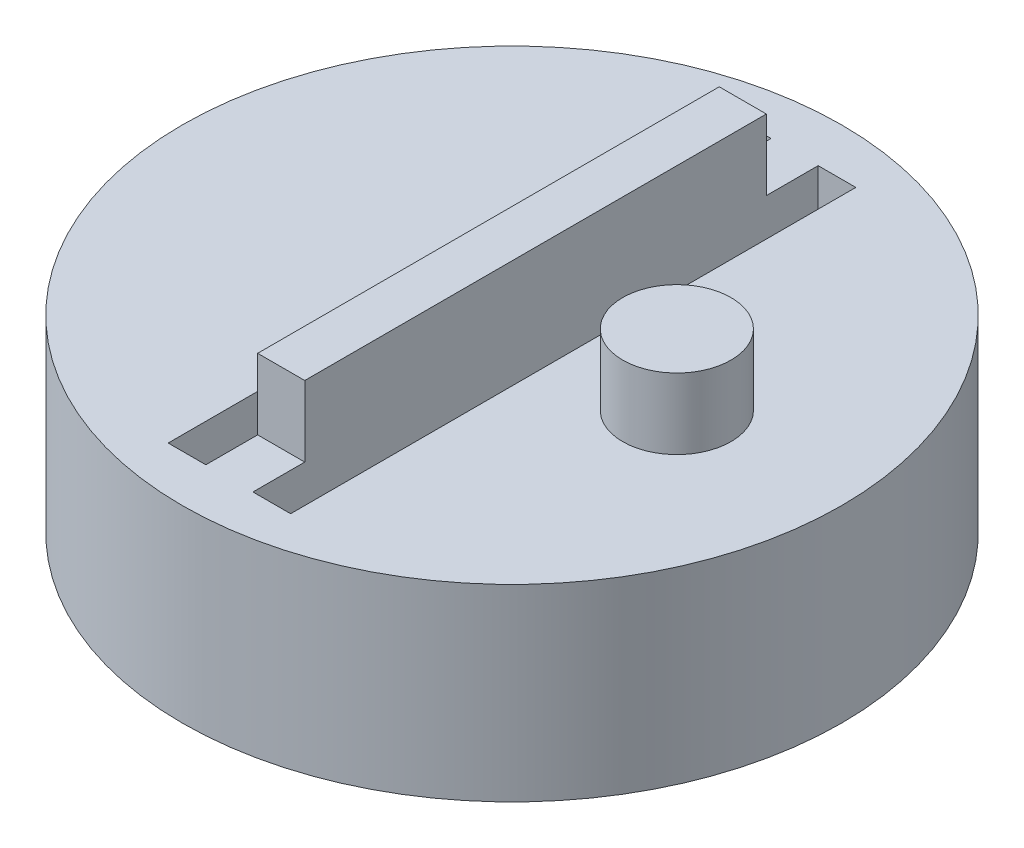
ISO-10303-21;
HEADER;
FILE_DESCRIPTION(('STEP AP214'),'2;1');
FILE_NAME('part.step','',(''),(''),'','','');
FILE_SCHEMA(('AUTOMOTIVE_DESIGN { 1 0 10303 214 1 1 1 1 }'));
ENDSEC;
DATA;
#1=APPLICATION_CONTEXT('core data for automotive mechanical design processes');
#2=APPLICATION_PROTOCOL_DEFINITION('international standard','automotive_design',2000,#1);
#3=PRODUCT_CONTEXT('',#1,'mechanical');
#4=PRODUCT('Part','Part','',(#3));
#5=PRODUCT_RELATED_PRODUCT_CATEGORY('part','',(#4));
#6=PRODUCT_DEFINITION_FORMATION('','',#4);
#7=PRODUCT_DEFINITION_CONTEXT('part definition',#1,'design');
#8=PRODUCT_DEFINITION('design','',#6,#7);
#9=PRODUCT_DEFINITION_SHAPE('','',#8);
#10=(LENGTH_UNIT() NAMED_UNIT(*) SI_UNIT(.MILLI.,.METRE.));
#11=(NAMED_UNIT(*) PLANE_ANGLE_UNIT() SI_UNIT($,.RADIAN.));
#12=(NAMED_UNIT(*) SI_UNIT($,.STERADIAN.) SOLID_ANGLE_UNIT());
#13=UNCERTAINTY_MEASURE_WITH_UNIT(LENGTH_MEASURE(1.E-05),#10,'distance_accuracy_value','');
#14=(GEOMETRIC_REPRESENTATION_CONTEXT(3) GLOBAL_UNCERTAINTY_ASSIGNED_CONTEXT((#13)) GLOBAL_UNIT_ASSIGNED_CONTEXT((#10,
#11,#12)) REPRESENTATION_CONTEXT('',''));
#15=CARTESIAN_POINT('',(0.,0.,0.));
#16=DIRECTION('',(0.,0.,1.));
#17=DIRECTION('',(1.,0.,0.));
#18=AXIS2_PLACEMENT_3D('',#15,#16,#17);
#19=CARTESIAN_POINT('',(0.,4.,0.));
#20=DIRECTION('',(0.,1.,0.));
#21=DIRECTION('',(0.,0.,1.));
#22=AXIS2_PLACEMENT_3D('',#19,#20,#21);
#23=PLANE('',#22);
#24=CARTESIAN_POINT('',(3.5,4.,0.));
#25=DIRECTION('',(0.,1.,0.));
#26=DIRECTION('',(0.,0.,1.));
#27=AXIS2_PLACEMENT_3D('',#24,#25,#26);
#28=CIRCLE('',#27,1.15);
#29=CARTESIAN_POINT('',(3.5,4.,1.15));
#30=VERTEX_POINT('',#29);
#31=EDGE_CURVE('E178',#30,#30,#28,.T.);
#32=ORIENTED_EDGE('',*,*,#31,.F.);
#33=EDGE_LOOP('',(#32));
#34=FACE_BOUND('',#33,.T.);
#35=DIRECTION('',(0.,0.,-1.));
#36=VECTOR('',#35,1.);
#37=CARTESIAN_POINT('',(-0.5,4.,0.));
#38=LINE('',#37,#36);
#39=CARTESIAN_POINT('',(-0.500000000000001,4.,-4.9));
#40=VERTEX_POINT('',#39);
#41=CARTESIAN_POINT('',(-0.5,4.,-6.));
#42=VERTEX_POINT('',#41);
#43=EDGE_CURVE('E148',#40,#42,#38,.T.);
#44=ORIENTED_EDGE('',*,*,#43,.F.);
#45=DIRECTION('',(-1.,0.,0.));
#46=VECTOR('',#45,1.);
#47=CARTESIAN_POINT('',(0.5,4.,-4.9));
#48=LINE('',#47,#46);
#49=CARTESIAN_POINT('',(0.5,4.,-4.9));
#50=VERTEX_POINT('',#49);
#51=EDGE_CURVE('E170',#50,#40,#48,.T.);
#52=ORIENTED_EDGE('',*,*,#51,.F.);
#53=DIRECTION('',(0.,0.,-1.));
#54=VECTOR('',#53,1.);
#55=CARTESIAN_POINT('',(0.5,4.,0.));
#56=LINE('',#55,#54);
#57=CARTESIAN_POINT('',(0.5,4.,-6.));
#58=VERTEX_POINT('',#57);
#59=EDGE_CURVE('E217',#50,#58,#56,.T.);
#60=ORIENTED_EDGE('',*,*,#59,.T.);
#61=DIRECTION('',(1.,0.,0.));
#62=VECTOR('',#61,1.);
#63=CARTESIAN_POINT('',(0.,4.,-6.));
#64=LINE('',#63,#62);
#65=CARTESIAN_POINT('',(1.3,4.,-6.));
#66=VERTEX_POINT('',#65);
#67=EDGE_CURVE('E213',#58,#66,#64,.T.);
#68=ORIENTED_EDGE('',*,*,#67,.T.);
#69=DIRECTION('',(0.,0.,-1.));
#70=VECTOR('',#69,1.);
#71=CARTESIAN_POINT('',(1.3,4.,0.));
#72=LINE('',#71,#70);
#73=CARTESIAN_POINT('',(1.3,4.,6.));
#74=VERTEX_POINT('',#73);
#75=EDGE_CURVE('E224',#74,#66,#72,.T.);
#76=ORIENTED_EDGE('',*,*,#75,.F.);
#77=DIRECTION('',(1.,0.,0.));
#78=VECTOR('',#77,1.);
#79=CARTESIAN_POINT('',(0.,4.,6.));
#80=LINE('',#79,#78);
#81=CARTESIAN_POINT('',(0.500000000000001,4.,6.));
#82=VERTEX_POINT('',#81);
#83=EDGE_CURVE('E220',#82,#74,#80,.T.);
#84=ORIENTED_EDGE('',*,*,#83,.F.);
#85=CARTESIAN_POINT('',(0.500000000000001,4.,4.9));
#86=VERTEX_POINT('',#85);
#87=EDGE_CURVE('E154',#82,#86,#56,.T.);
#88=ORIENTED_EDGE('',*,*,#87,.T.);
#89=DIRECTION('',(1.,0.,0.));
#90=VECTOR('',#89,1.);
#91=CARTESIAN_POINT('',(-0.500000000000001,4.,4.9));
#92=LINE('',#91,#90);
#93=CARTESIAN_POINT('',(-0.500000000000001,4.,4.9));
#94=VERTEX_POINT('',#93);
#95=EDGE_CURVE('E150',#94,#86,#92,.T.);
#96=ORIENTED_EDGE('',*,*,#95,.F.);
#97=CARTESIAN_POINT('',(-0.500000000000001,4.,6.));
#98=VERTEX_POINT('',#97);
#99=EDGE_CURVE('E134',#98,#94,#38,.T.);
#100=ORIENTED_EDGE('',*,*,#99,.F.);
#101=DIRECTION('',(-1.,0.,0.));
#102=VECTOR('',#101,1.);
#103=CARTESIAN_POINT('',(0.,4.,6.));
#104=LINE('',#103,#102);
#105=CARTESIAN_POINT('',(-1.3,4.,6.));
#106=VERTEX_POINT('',#105);
#107=EDGE_CURVE('E194',#98,#106,#104,.T.);
#108=ORIENTED_EDGE('',*,*,#107,.T.);
#109=DIRECTION('',(0.,0.,-1.));
#110=VECTOR('',#109,1.);
#111=CARTESIAN_POINT('',(-1.3,4.,0.));
#112=LINE('',#111,#110);
#113=CARTESIAN_POINT('',(-1.3,4.,-6.));
#114=VERTEX_POINT('',#113);
#115=EDGE_CURVE('E190',#106,#114,#112,.T.);
#116=ORIENTED_EDGE('',*,*,#115,.T.);
#117=DIRECTION('',(-1.,0.,0.));
#118=VECTOR('',#117,1.);
#119=CARTESIAN_POINT('',(0.,4.,-6.));
#120=LINE('',#119,#118);
#121=EDGE_CURVE('E183',#42,#114,#120,.T.);
#122=ORIENTED_EDGE('',*,*,#121,.F.);
#123=EDGE_LOOP('',(#44,#52,#60,#68,#76,#84,#88,#96,#100,#108,#116,#122));
#124=FACE_BOUND('',#123,.T.);
#125=CARTESIAN_POINT('',(0.,4.,0.));
#126=DIRECTION('',(0.,1.,0.));
#127=DIRECTION('',(0.,0.,1.));
#128=AXIS2_PLACEMENT_3D('',#125,#126,#127);
#129=CIRCLE('',#128,7.);
#130=CARTESIAN_POINT('',(0.,4.,7.));
#131=VERTEX_POINT('',#130);
#132=EDGE_CURVE('E242',#131,#131,#129,.T.);
#133=ORIENTED_EDGE('',*,*,#132,.T.);
#134=EDGE_LOOP('',(#133));
#135=FACE_BOUND('',#134,.T.);
#136=ADVANCED_FACE('F41',(#34,#124,#135),#23,.T.);
#137=CARTESIAN_POINT('',(0.,0.,0.));
#138=DIRECTION('',(0.,1.,0.));
#139=DIRECTION('',(0.,0.,1.));
#140=AXIS2_PLACEMENT_3D('',#137,#138,#139);
#141=PLANE('',#140);
#142=DIRECTION('',(0.,0.,-1.));
#143=VECTOR('',#142,1.);
#144=CARTESIAN_POINT('',(-0.5,0.,0.));
#145=LINE('',#144,#143);
#146=CARTESIAN_POINT('',(-0.500000000000001,0.,6.));
#147=VERTEX_POINT('',#146);
#148=CARTESIAN_POINT('',(-0.5,0.,-6.));
#149=VERTEX_POINT('',#148);
#150=EDGE_CURVE('E50',#147,#149,#145,.T.);
#151=ORIENTED_EDGE('',*,*,#150,.T.);
#152=DIRECTION('',(-1.,0.,0.));
#153=VECTOR('',#152,1.);
#154=CARTESIAN_POINT('',(0.,0.,-6.));
#155=LINE('',#154,#153);
#156=CARTESIAN_POINT('',(-1.3,0.,-6.));
#157=VERTEX_POINT('',#156);
#158=EDGE_CURVE('E11',#149,#157,#155,.T.);
#159=ORIENTED_EDGE('',*,*,#158,.T.);
#160=DIRECTION('',(0.,0.,-1.));
#161=VECTOR('',#160,1.);
#162=CARTESIAN_POINT('',(-1.3,0.,0.));
#163=LINE('',#162,#161);
#164=CARTESIAN_POINT('',(-1.3,0.,6.));
#165=VERTEX_POINT('',#164);
#166=EDGE_CURVE('E263',#165,#157,#163,.T.);
#167=ORIENTED_EDGE('',*,*,#166,.F.);
#168=DIRECTION('',(-1.,0.,0.));
#169=VECTOR('',#168,1.);
#170=CARTESIAN_POINT('',(0.,0.,6.));
#171=LINE('',#170,#169);
#172=EDGE_CURVE('E266',#147,#165,#171,.T.);
#173=ORIENTED_EDGE('',*,*,#172,.F.);
#174=EDGE_LOOP('',(#151,#159,#167,#173));
#175=FACE_BOUND('',#174,.T.);
#176=CARTESIAN_POINT('',(0.,0.,0.));
#177=DIRECTION('',(0.,1.,0.));
#178=DIRECTION('',(0.,0.,1.));
#179=AXIS2_PLACEMENT_3D('',#176,#177,#178);
#180=CIRCLE('',#179,7.);
#181=CARTESIAN_POINT('',(0.,0.,7.));
#182=VERTEX_POINT('',#181);
#183=EDGE_CURVE('E232',#182,#182,#180,.T.);
#184=ORIENTED_EDGE('',*,*,#183,.F.);
#185=EDGE_LOOP('',(#184));
#186=FACE_BOUND('',#185,.T.);
#187=DIRECTION('',(1.,0.,0.));
#188=VECTOR('',#187,1.);
#189=CARTESIAN_POINT('',(0.,0.,-6.));
#190=LINE('',#189,#188);
#191=CARTESIAN_POINT('',(0.5,0.,-6.));
#192=VERTEX_POINT('',#191);
#193=CARTESIAN_POINT('',(1.3,0.,-6.));
#194=VERTEX_POINT('',#193);
#195=EDGE_CURVE('E260',#192,#194,#190,.T.);
#196=ORIENTED_EDGE('',*,*,#195,.F.);
#197=DIRECTION('',(0.,0.,-1.));
#198=VECTOR('',#197,1.);
#199=CARTESIAN_POINT('',(0.5,0.,0.));
#200=LINE('',#199,#198);
#201=CARTESIAN_POINT('',(0.5,0.,6.));
#202=VERTEX_POINT('',#201);
#203=EDGE_CURVE('E246',#202,#192,#200,.T.);
#204=ORIENTED_EDGE('',*,*,#203,.F.);
#205=DIRECTION('',(1.,0.,0.));
#206=VECTOR('',#205,1.);
#207=CARTESIAN_POINT('',(0.,0.,6.));
#208=LINE('',#207,#206);
#209=CARTESIAN_POINT('',(1.3,0.,6.));
#210=VERTEX_POINT('',#209);
#211=EDGE_CURVE('E252',#202,#210,#208,.T.);
#212=ORIENTED_EDGE('',*,*,#211,.T.);
#213=DIRECTION('',(0.,0.,-1.));
#214=VECTOR('',#213,1.);
#215=CARTESIAN_POINT('',(1.3,0.,0.));
#216=LINE('',#215,#214);
#217=EDGE_CURVE('E256',#210,#194,#216,.T.);
#218=ORIENTED_EDGE('',*,*,#217,.T.);
#219=EDGE_LOOP('',(#196,#204,#212,#218));
#220=FACE_BOUND('',#219,.T.);
#221=ADVANCED_FACE('F273',(#175,#186,#220),#141,.F.);
#222=CARTESIAN_POINT('',(0.,4.,0.));
#223=DIRECTION('',(0.,-1.,0.));
#224=DIRECTION('',(0.,0.,-1.));
#225=AXIS2_PLACEMENT_3D('',#222,#223,#224);
#226=CYLINDRICAL_SURFACE('',#225,7.);
#227=ORIENTED_EDGE('',*,*,#132,.F.);
#228=EDGE_LOOP('',(#227));
#229=FACE_BOUND('',#228,.T.);
#230=ORIENTED_EDGE('',*,*,#183,.T.);
#231=EDGE_LOOP('',(#230));
#232=FACE_BOUND('',#231,.T.);
#233=ADVANCED_FACE('F43',(#229,#232),#226,.T.);
#234=CARTESIAN_POINT('',(0.,-6.,-6.));
#235=DIRECTION('',(0.,0.,1.));
#236=DIRECTION('',(1.,0.,0.));
#237=AXIS2_PLACEMENT_3D('',#234,#235,#236);
#238=PLANE('',#237);
#239=ORIENTED_EDGE('',*,*,#195,.T.);
#240=DIRECTION('',(0.,1.,0.));
#241=VECTOR('',#240,1.);
#242=CARTESIAN_POINT('',(1.3,-6.,-6.));
#243=LINE('',#242,#241);
#244=EDGE_CURVE('E229',#194,#66,#243,.T.);
#245=ORIENTED_EDGE('',*,*,#244,.T.);
#246=ORIENTED_EDGE('',*,*,#67,.F.);
#247=DIRECTION('',(0.,1.,0.));
#248=VECTOR('',#247,1.);
#249=CARTESIAN_POINT('',(0.5,-6.,-6.));
#250=LINE('',#249,#248);
#251=EDGE_CURVE('E228',#192,#58,#250,.T.);
#252=ORIENTED_EDGE('',*,*,#251,.F.);
#253=EDGE_LOOP('',(#239,#245,#246,#252));
#254=FACE_BOUND('',#253,.T.);
#255=ADVANCED_FACE('F296',(#254),#238,.T.);
#256=CARTESIAN_POINT('',(1.3,-6.,0.));
#257=DIRECTION('',(1.,0.,0.));
#258=DIRECTION('',(0.,0.,-1.));
#259=AXIS2_PLACEMENT_3D('',#256,#257,#258);
#260=PLANE('',#259);
#261=DIRECTION('',(0.,1.,0.));
#262=VECTOR('',#261,1.);
#263=CARTESIAN_POINT('',(1.3,-6.,6.));
#264=LINE('',#263,#262);
#265=EDGE_CURVE('E233',#210,#74,#264,.T.);
#266=ORIENTED_EDGE('',*,*,#265,.T.);
#267=ORIENTED_EDGE('',*,*,#75,.T.);
#268=ORIENTED_EDGE('',*,*,#244,.F.);
#269=ORIENTED_EDGE('',*,*,#217,.F.);
#270=EDGE_LOOP('',(#266,#267,#268,#269));
#271=FACE_BOUND('',#270,.T.);
#272=ADVANCED_FACE('F304',(#271),#260,.F.);
#273=CARTESIAN_POINT('',(0.,-6.,6.));
#274=DIRECTION('',(0.,0.,1.));
#275=DIRECTION('',(1.,0.,0.));
#276=AXIS2_PLACEMENT_3D('',#273,#274,#275);
#277=PLANE('',#276);
#278=DIRECTION('',(0.,1.,0.));
#279=VECTOR('',#278,1.);
#280=CARTESIAN_POINT('',(0.500000000000001,-6.,6.));
#281=LINE('',#280,#279);
#282=EDGE_CURVE('E236',#202,#82,#281,.T.);
#283=ORIENTED_EDGE('',*,*,#282,.T.);
#284=ORIENTED_EDGE('',*,*,#83,.T.);
#285=ORIENTED_EDGE('',*,*,#265,.F.);
#286=ORIENTED_EDGE('',*,*,#211,.F.);
#287=EDGE_LOOP('',(#283,#284,#285,#286));
#288=FACE_BOUND('',#287,.T.);
#289=ADVANCED_FACE('F307',(#288),#277,.F.);
#290=CARTESIAN_POINT('',(0.5,-6.,0.));
#291=DIRECTION('',(1.,0.,0.));
#292=DIRECTION('',(0.,0.,-1.));
#293=AXIS2_PLACEMENT_3D('',#290,#291,#292);
#294=PLANE('',#293);
#295=DIRECTION('',(0.,1.,0.));
#296=VECTOR('',#295,1.);
#297=CARTESIAN_POINT('',(0.500000000000001,4.,4.9));
#298=LINE('',#297,#296);
#299=CARTESIAN_POINT('',(0.500000000000001,5.5,4.9));
#300=VERTEX_POINT('',#299);
#301=EDGE_CURVE('E57',#86,#300,#298,.T.);
#302=ORIENTED_EDGE('',*,*,#301,.F.);
#303=ORIENTED_EDGE('',*,*,#87,.F.);
#304=ORIENTED_EDGE('',*,*,#282,.F.);
#305=ORIENTED_EDGE('',*,*,#203,.T.);
#306=ORIENTED_EDGE('',*,*,#251,.T.);
#307=ORIENTED_EDGE('',*,*,#59,.F.);
#308=DIRECTION('',(0.,-1.,0.));
#309=VECTOR('',#308,1.);
#310=CARTESIAN_POINT('',(0.5,4.,-4.9));
#311=LINE('',#310,#309);
#312=CARTESIAN_POINT('',(0.5,5.5,-4.9));
#313=VERTEX_POINT('',#312);
#314=EDGE_CURVE('E166',#313,#50,#311,.T.);
#315=ORIENTED_EDGE('',*,*,#314,.F.);
#316=DIRECTION('',(0.,0.,-1.));
#317=VECTOR('',#316,1.);
#318=CARTESIAN_POINT('',(0.500000000000001,5.5,5.4));
#319=LINE('',#318,#317);
#320=EDGE_CURVE('E200',#300,#313,#319,.T.);
#321=ORIENTED_EDGE('',*,*,#320,.F.);
#322=EDGE_LOOP('',(#302,#303,#304,#305,#306,#307,#315,#321));
#323=FACE_BOUND('',#322,.T.);
#324=ADVANCED_FACE('F299',(#323),#294,.T.);
#325=CARTESIAN_POINT('',(-0.500000000000001,5.5,5.4));
#326=DIRECTION('',(1.,0.,0.));
#327=DIRECTION('',(0.,0.,-1.));
#328=AXIS2_PLACEMENT_3D('',#325,#326,#327);
#329=PLANE('',#328);
#330=ORIENTED_EDGE('',*,*,#99,.T.);
#331=DIRECTION('',(0.,-1.,0.));
#332=VECTOR('',#331,1.);
#333=CARTESIAN_POINT('',(-0.500000000000001,4.,4.9));
#334=LINE('',#333,#332);
#335=CARTESIAN_POINT('',(-0.500000000000001,5.5,4.9));
#336=VERTEX_POINT('',#335);
#337=EDGE_CURVE('E139',#336,#94,#334,.T.);
#338=ORIENTED_EDGE('',*,*,#337,.F.);
#339=DIRECTION('',(0.,0.,1.));
#340=VECTOR('',#339,1.);
#341=CARTESIAN_POINT('',(-0.500000000000001,5.5,5.4));
#342=LINE('',#341,#340);
#343=CARTESIAN_POINT('',(-0.500000000000001,5.5,-4.9));
#344=VERTEX_POINT('',#343);
#345=EDGE_CURVE('E210',#344,#336,#342,.T.);
#346=ORIENTED_EDGE('',*,*,#345,.F.);
#347=DIRECTION('',(0.,1.,0.));
#348=VECTOR('',#347,1.);
#349=CARTESIAN_POINT('',(-0.500000000000001,4.,-4.9));
#350=LINE('',#349,#348);
#351=EDGE_CURVE('E65',#40,#344,#350,.T.);
#352=ORIENTED_EDGE('',*,*,#351,.F.);
#353=ORIENTED_EDGE('',*,*,#43,.T.);
#354=DIRECTION('',(0.,1.,0.));
#355=VECTOR('',#354,1.);
#356=CARTESIAN_POINT('',(-0.5,-6.,-6.));
#357=LINE('',#356,#355);
#358=EDGE_CURVE('E197',#149,#42,#357,.T.);
#359=ORIENTED_EDGE('',*,*,#358,.F.);
#360=ORIENTED_EDGE('',*,*,#150,.F.);
#361=DIRECTION('',(0.,1.,0.));
#362=VECTOR('',#361,1.);
#363=CARTESIAN_POINT('',(-0.500000000000001,-6.,6.));
#364=LINE('',#363,#362);
#365=EDGE_CURVE('E142',#147,#98,#364,.T.);
#366=ORIENTED_EDGE('',*,*,#365,.T.);
#367=EDGE_LOOP('',(#330,#338,#346,#352,#353,#359,#360,#366));
#368=FACE_BOUND('',#367,.T.);
#369=ADVANCED_FACE('F136',(#368),#329,.F.);
#370=CARTESIAN_POINT('',(0.,5.5,0.));
#371=DIRECTION('',(0.,-1.,0.));
#372=DIRECTION('',(0.,0.,-1.));
#373=AXIS2_PLACEMENT_3D('',#370,#371,#372);
#374=PLANE('',#373);
#375=ORIENTED_EDGE('',*,*,#345,.T.);
#376=DIRECTION('',(-1.,0.,0.));
#377=VECTOR('',#376,1.);
#378=CARTESIAN_POINT('',(-0.500000000000001,5.5,4.9));
#379=LINE('',#378,#377);
#380=EDGE_CURVE('E158',#300,#336,#379,.T.);
#381=ORIENTED_EDGE('',*,*,#380,.F.);
#382=ORIENTED_EDGE('',*,*,#320,.T.);
#383=DIRECTION('',(1.,0.,0.));
#384=VECTOR('',#383,1.);
#385=CARTESIAN_POINT('',(0.5,5.5,-4.9));
#386=LINE('',#385,#384);
#387=EDGE_CURVE('E175',#344,#313,#386,.T.);
#388=ORIENTED_EDGE('',*,*,#387,.F.);
#389=EDGE_LOOP('',(#375,#381,#382,#388));
#390=FACE_BOUND('',#389,.T.);
#391=ADVANCED_FACE('F310',(#390),#374,.F.);
#392=CARTESIAN_POINT('',(0.,-6.,-6.));
#393=DIRECTION('',(0.,0.,-1.));
#394=DIRECTION('',(-1.,0.,0.));
#395=AXIS2_PLACEMENT_3D('',#392,#393,#394);
#396=PLANE('',#395);
#397=ORIENTED_EDGE('',*,*,#358,.T.);
#398=ORIENTED_EDGE('',*,*,#121,.T.);
#399=DIRECTION('',(0.,1.,0.));
#400=VECTOR('',#399,1.);
#401=CARTESIAN_POINT('',(-1.3,-6.,-6.));
#402=LINE('',#401,#400);
#403=EDGE_CURVE('E147',#157,#114,#402,.T.);
#404=ORIENTED_EDGE('',*,*,#403,.F.);
#405=ORIENTED_EDGE('',*,*,#158,.F.);
#406=EDGE_LOOP('',(#397,#398,#404,#405));
#407=FACE_BOUND('',#406,.T.);
#408=ADVANCED_FACE('F286',(#407),#396,.F.);
#409=CARTESIAN_POINT('',(0.,-6.,6.));
#410=DIRECTION('',(0.,0.,-1.));
#411=DIRECTION('',(-1.,0.,0.));
#412=AXIS2_PLACEMENT_3D('',#409,#410,#411);
#413=PLANE('',#412);
#414=ORIENTED_EDGE('',*,*,#172,.T.);
#415=DIRECTION('',(0.,1.,0.));
#416=VECTOR('',#415,1.);
#417=CARTESIAN_POINT('',(-1.3,-6.,6.));
#418=LINE('',#417,#416);
#419=EDGE_CURVE('E203',#165,#106,#418,.T.);
#420=ORIENTED_EDGE('',*,*,#419,.T.);
#421=ORIENTED_EDGE('',*,*,#107,.F.);
#422=ORIENTED_EDGE('',*,*,#365,.F.);
#423=EDGE_LOOP('',(#414,#420,#421,#422));
#424=FACE_BOUND('',#423,.T.);
#425=ADVANCED_FACE('F279',(#424),#413,.T.);
#426=CARTESIAN_POINT('',(-1.3,-6.,0.));
#427=DIRECTION('',(1.,0.,0.));
#428=DIRECTION('',(0.,0.,-1.));
#429=AXIS2_PLACEMENT_3D('',#426,#427,#428);
#430=PLANE('',#429);
#431=ORIENTED_EDGE('',*,*,#166,.T.);
#432=ORIENTED_EDGE('',*,*,#403,.T.);
#433=ORIENTED_EDGE('',*,*,#115,.F.);
#434=ORIENTED_EDGE('',*,*,#419,.F.);
#435=EDGE_LOOP('',(#431,#432,#433,#434));
#436=FACE_BOUND('',#435,.T.);
#437=ADVANCED_FACE('F283',(#436),#430,.T.);
#438=CARTESIAN_POINT('',(3.5,5.5,0.));
#439=DIRECTION('',(0.,-1.,0.));
#440=DIRECTION('',(0.,0.,-1.));
#441=AXIS2_PLACEMENT_3D('',#438,#439,#440);
#442=CYLINDRICAL_SURFACE('',#441,1.15);
#443=CARTESIAN_POINT('',(3.5,5.5,0.));
#444=DIRECTION('',(0.,1.,0.));
#445=DIRECTION('',(0.,0.,1.));
#446=AXIS2_PLACEMENT_3D('',#443,#444,#445);
#447=CIRCLE('',#446,1.15);
#448=CARTESIAN_POINT('',(3.5,5.5,1.15));
#449=VERTEX_POINT('',#448);
#450=EDGE_CURVE('E179',#449,#449,#447,.T.);
#451=ORIENTED_EDGE('',*,*,#450,.F.);
#452=EDGE_LOOP('',(#451));
#453=FACE_BOUND('',#452,.T.);
#454=ORIENTED_EDGE('',*,*,#31,.T.);
#455=EDGE_LOOP('',(#454));
#456=FACE_BOUND('',#455,.T.);
#457=ADVANCED_FACE('F320',(#453,#456),#442,.T.);
#458=CARTESIAN_POINT('',(0.,5.5,0.));
#459=DIRECTION('',(0.,1.,0.));
#460=DIRECTION('',(0.,0.,1.));
#461=AXIS2_PLACEMENT_3D('',#458,#459,#460);
#462=PLANE('',#461);
#463=ORIENTED_EDGE('',*,*,#450,.T.);
#464=EDGE_LOOP('',(#463));
#465=FACE_BOUND('',#464,.T.);
#466=ADVANCED_FACE('F313',(#465),#462,.T.);
#467=CARTESIAN_POINT('',(0.,0.,-4.9));
#468=DIRECTION('',(0.,0.,1.));
#469=DIRECTION('',(1.,0.,0.));
#470=AXIS2_PLACEMENT_3D('',#467,#468,#469);
#471=PLANE('',#470);
#472=ORIENTED_EDGE('',*,*,#314,.T.);
#473=ORIENTED_EDGE('',*,*,#51,.T.);
#474=ORIENTED_EDGE('',*,*,#351,.T.);
#475=ORIENTED_EDGE('',*,*,#387,.T.);
#476=EDGE_LOOP('',(#472,#473,#474,#475));
#477=FACE_BOUND('',#476,.T.);
#478=ADVANCED_FACE('F311',(#477),#471,.F.);
#479=CARTESIAN_POINT('',(0.,0.,4.9));
#480=DIRECTION('',(0.,0.,-1.));
#481=DIRECTION('',(-1.,0.,0.));
#482=AXIS2_PLACEMENT_3D('',#479,#480,#481);
#483=PLANE('',#482);
#484=ORIENTED_EDGE('',*,*,#337,.T.);
#485=ORIENTED_EDGE('',*,*,#95,.T.);
#486=ORIENTED_EDGE('',*,*,#301,.T.);
#487=ORIENTED_EDGE('',*,*,#380,.T.);
#488=EDGE_LOOP('',(#484,#485,#486,#487));
#489=FACE_BOUND('',#488,.T.);
#490=ADVANCED_FACE('F157',(#489),#483,.F.);
#491=CLOSED_SHELL('',(#136,#221,#233,#255,#272,#289,#324,#369,#391,#408,#425,#437,#457,#466,
#478,#490));
#492=MANIFOLD_SOLID_BREP('B2',#491);
#493=ADVANCED_BREP_SHAPE_REPRESENTATION('',(#18,#492),#14);
#494=SHAPE_DEFINITION_REPRESENTATION(#9,#493);
ENDSEC;
END-ISO-10303-21;
